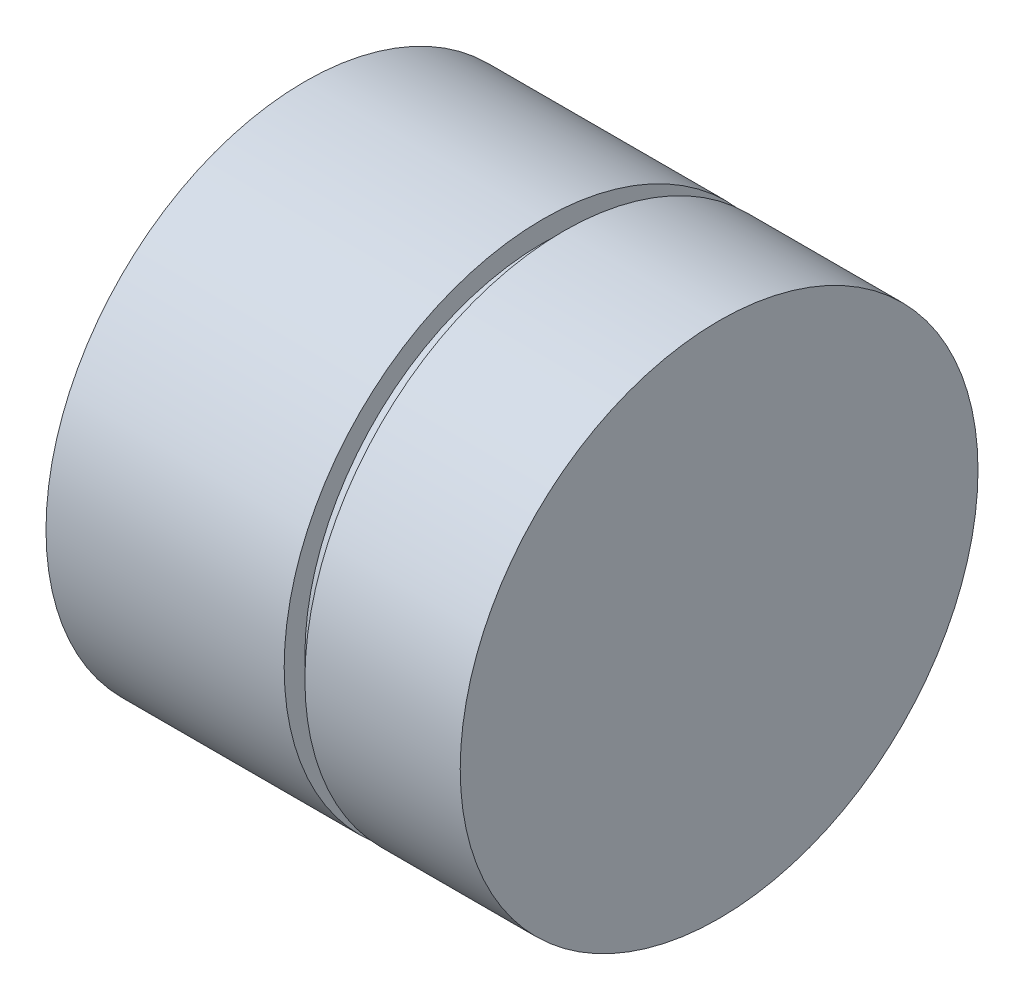
ISO-10303-21;
HEADER;
FILE_DESCRIPTION(('STEP AP214'),'2;1');
FILE_NAME('part.step','',(''),(''),'','','');
FILE_SCHEMA(('AUTOMOTIVE_DESIGN { 1 0 10303 214 1 1 1 1 }'));
ENDSEC;
DATA;
#1=APPLICATION_CONTEXT('core data for automotive mechanical design processes');
#2=APPLICATION_PROTOCOL_DEFINITION('international standard','automotive_design',2000,#1);
#3=PRODUCT_CONTEXT('',#1,'mechanical');
#4=PRODUCT('Part','Part','',(#3));
#5=PRODUCT_RELATED_PRODUCT_CATEGORY('part','',(#4));
#6=PRODUCT_DEFINITION_FORMATION('','',#4);
#7=PRODUCT_DEFINITION_CONTEXT('part definition',#1,'design');
#8=PRODUCT_DEFINITION('design','',#6,#7);
#9=PRODUCT_DEFINITION_SHAPE('','',#8);
#10=(LENGTH_UNIT() NAMED_UNIT(*) SI_UNIT(.MILLI.,.METRE.));
#11=(NAMED_UNIT(*) PLANE_ANGLE_UNIT() SI_UNIT($,.RADIAN.));
#12=(NAMED_UNIT(*) SI_UNIT($,.STERADIAN.) SOLID_ANGLE_UNIT());
#13=UNCERTAINTY_MEASURE_WITH_UNIT(LENGTH_MEASURE(1.E-05),#10,'distance_accuracy_value','');
#14=(GEOMETRIC_REPRESENTATION_CONTEXT(3) GLOBAL_UNCERTAINTY_ASSIGNED_CONTEXT((#13)) GLOBAL_UNIT_ASSIGNED_CONTEXT((#10,
#11,#12)) REPRESENTATION_CONTEXT('',''));
#15=CARTESIAN_POINT('',(0.,0.,0.));
#16=DIRECTION('',(0.,0.,1.));
#17=DIRECTION('',(1.,0.,0.));
#18=AXIS2_PLACEMENT_3D('',#15,#16,#17);
#19=CARTESIAN_POINT('',(2.5,0.,0.));
#20=DIRECTION('',(-1.,0.,0.));
#21=DIRECTION('',(0.,0.,1.));
#22=AXIS2_PLACEMENT_3D('',#19,#20,#21);
#23=CYLINDRICAL_SURFACE('',#22,2.5);
#24=CARTESIAN_POINT('',(0.,0.,0.));
#25=DIRECTION('',(1.,0.,0.));
#26=DIRECTION('',(0.,0.,-1.));
#27=AXIS2_PLACEMENT_3D('',#24,#25,#26);
#28=CIRCLE('',#27,2.5);
#29=CARTESIAN_POINT('',(0.,0.,-2.5));
#30=VERTEX_POINT('',#29);
#31=EDGE_CURVE('E10',#30,#30,#28,.T.);
#32=ORIENTED_EDGE('',*,*,#31,.T.);
#33=EDGE_LOOP('',(#32));
#34=FACE_BOUND('',#33,.T.);
#35=CARTESIAN_POINT('',(2.3,0.,0.));
#36=DIRECTION('',(1.,0.,0.));
#37=DIRECTION('',(0.,0.,-1.));
#38=AXIS2_PLACEMENT_3D('',#35,#36,#37);
#39=CIRCLE('',#38,2.5);
#40=CARTESIAN_POINT('',(2.3,0.,-2.5));
#41=VERTEX_POINT('',#40);
#42=EDGE_CURVE('E59',#41,#41,#39,.T.);
#43=ORIENTED_EDGE('',*,*,#42,.F.);
#44=EDGE_LOOP('',(#43));
#45=FACE_BOUND('',#44,.T.);
#46=ADVANCED_FACE('F51',(#34,#45),#23,.T.);
#47=CARTESIAN_POINT('',(0.,0.,0.));
#48=DIRECTION('',(1.,0.,0.));
#49=DIRECTION('',(0.,0.,-1.));
#50=AXIS2_PLACEMENT_3D('',#47,#48,#49);
#51=PLANE('',#50);
#52=CARTESIAN_POINT('',(0.,1.,0.));
#53=DIRECTION('',(-1.,0.,0.));
#54=DIRECTION('',(0.,0.,1.));
#55=AXIS2_PLACEMENT_3D('',#52,#53,#54);
#56=CIRCLE('',#55,0.15);
#57=CARTESIAN_POINT('',(0.,1.,0.15));
#58=VERTEX_POINT('',#57);
#59=EDGE_CURVE('E109',#58,#58,#56,.T.);
#60=ORIENTED_EDGE('',*,*,#59,.F.);
#61=EDGE_LOOP('',(#60));
#62=FACE_BOUND('',#61,.T.);
#63=CARTESIAN_POINT('',(0.,-0.500000000000004,-0.866025403784436));
#64=DIRECTION('',(-1.,0.,0.));
#65=DIRECTION('',(0.,0.,1.));
#66=AXIS2_PLACEMENT_3D('',#63,#64,#65);
#67=CIRCLE('',#66,0.15);
#68=CARTESIAN_POINT('',(0.,-0.500000000000004,-0.716025403784436));
#69=VERTEX_POINT('',#68);
#70=EDGE_CURVE('E106',#69,#69,#67,.T.);
#71=ORIENTED_EDGE('',*,*,#70,.F.);
#72=EDGE_LOOP('',(#71));
#73=FACE_BOUND('',#72,.T.);
#74=CARTESIAN_POINT('',(0.,-0.500000000000004,0.866025403784436));
#75=DIRECTION('',(-1.,0.,0.));
#76=DIRECTION('',(0.,0.,1.));
#77=AXIS2_PLACEMENT_3D('',#74,#75,#76);
#78=CIRCLE('',#77,0.15);
#79=CARTESIAN_POINT('',(0.,-0.500000000000004,1.01602540378444));
#80=VERTEX_POINT('',#79);
#81=EDGE_CURVE('E98',#80,#80,#78,.T.);
#82=ORIENTED_EDGE('',*,*,#81,.F.);
#83=EDGE_LOOP('',(#82));
#84=FACE_BOUND('',#83,.T.);
#85=CARTESIAN_POINT('',(0.,0.,0.));
#86=DIRECTION('',(-1.,0.,0.));
#87=DIRECTION('',(0.,0.,1.));
#88=AXIS2_PLACEMENT_3D('',#85,#86,#87);
#89=CIRCLE('',#88,0.5);
#90=CARTESIAN_POINT('',(0.,0.,0.5));
#91=VERTEX_POINT('',#90);
#92=EDGE_CURVE('E88',#91,#91,#89,.T.);
#93=ORIENTED_EDGE('',*,*,#92,.F.);
#94=EDGE_LOOP('',(#93));
#95=FACE_BOUND('',#94,.T.);
#96=ORIENTED_EDGE('',*,*,#31,.F.);
#97=EDGE_LOOP('',(#96));
#98=FACE_BOUND('',#97,.T.);
#99=ADVANCED_FACE('F126',(#62,#73,#84,#95,#98),#51,.F.);
#100=CARTESIAN_POINT('',(2.5,0.,0.));
#101=DIRECTION('',(1.,0.,0.));
#102=DIRECTION('',(0.,0.,-1.));
#103=AXIS2_PLACEMENT_3D('',#100,#101,#102);
#104=PLANE('',#103);
#105=CARTESIAN_POINT('',(2.5,0.,0.));
#106=DIRECTION('',(1.,0.,0.));
#107=DIRECTION('',(0.,0.,-1.));
#108=AXIS2_PLACEMENT_3D('',#105,#106,#107);
#109=CIRCLE('',#108,2.3);
#110=CARTESIAN_POINT('',(2.5,0.,-2.3));
#111=VERTEX_POINT('',#110);
#112=EDGE_CURVE('E72',#111,#111,#109,.T.);
#113=ORIENTED_EDGE('',*,*,#112,.T.);
#114=EDGE_LOOP('',(#113));
#115=FACE_BOUND('',#114,.T.);
#116=CARTESIAN_POINT('',(2.5,0.,0.));
#117=DIRECTION('',(-1.,0.,0.));
#118=DIRECTION('',(0.,0.,1.));
#119=AXIS2_PLACEMENT_3D('',#116,#117,#118);
#120=CIRCLE('',#119,2.5);
#121=CARTESIAN_POINT('',(2.5,0.,2.5));
#122=VERTEX_POINT('',#121);
#123=EDGE_CURVE('E79',#122,#122,#120,.T.);
#124=ORIENTED_EDGE('',*,*,#123,.T.);
#125=EDGE_LOOP('',(#124));
#126=FACE_BOUND('',#125,.T.);
#127=ADVANCED_FACE('F131',(#115,#126),#104,.F.);
#128=CARTESIAN_POINT('',(2.3,0.,0.));
#129=DIRECTION('',(1.,0.,0.));
#130=DIRECTION('',(0.,0.,-1.));
#131=AXIS2_PLACEMENT_3D('',#128,#129,#130);
#132=PLANE('',#131);
#133=CARTESIAN_POINT('',(2.3,0.,0.));
#134=DIRECTION('',(1.,0.,0.));
#135=DIRECTION('',(0.,0.,-1.));
#136=AXIS2_PLACEMENT_3D('',#133,#134,#135);
#137=CIRCLE('',#136,2.3);
#138=CARTESIAN_POINT('',(2.3,0.,-2.3));
#139=VERTEX_POINT('',#138);
#140=EDGE_CURVE('E65',#139,#139,#137,.T.);
#141=ORIENTED_EDGE('',*,*,#140,.F.);
#142=EDGE_LOOP('',(#141));
#143=FACE_BOUND('',#142,.T.);
#144=ORIENTED_EDGE('',*,*,#42,.T.);
#145=EDGE_LOOP('',(#144));
#146=FACE_BOUND('',#145,.T.);
#147=ADVANCED_FACE('F172',(#143,#146),#132,.T.);
#148=CARTESIAN_POINT('',(2.3,0.,0.));
#149=DIRECTION('',(1.,0.,0.));
#150=DIRECTION('',(0.,0.,-1.));
#151=AXIS2_PLACEMENT_3D('',#148,#149,#150);
#152=CYLINDRICAL_SURFACE('',#151,2.3);
#153=ORIENTED_EDGE('',*,*,#140,.T.);
#154=EDGE_LOOP('',(#153));
#155=FACE_BOUND('',#154,.T.);
#156=ORIENTED_EDGE('',*,*,#112,.F.);
#157=EDGE_LOOP('',(#156));
#158=FACE_BOUND('',#157,.T.);
#159=ADVANCED_FACE('F178',(#155,#158),#152,.T.);
#160=CARTESIAN_POINT('',(4.,0.,0.));
#161=DIRECTION('',(-1.,0.,0.));
#162=DIRECTION('',(0.,0.,1.));
#163=AXIS2_PLACEMENT_3D('',#160,#161,#162);
#164=CYLINDRICAL_SURFACE('',#163,2.5);
#165=CARTESIAN_POINT('',(4.,0.,0.));
#166=DIRECTION('',(-1.,0.,0.));
#167=DIRECTION('',(0.,0.,1.));
#168=AXIS2_PLACEMENT_3D('',#165,#166,#167);
#169=CIRCLE('',#168,2.5);
#170=CARTESIAN_POINT('',(4.,0.,2.5));
#171=VERTEX_POINT('',#170);
#172=EDGE_CURVE('E76',#171,#171,#169,.T.);
#173=ORIENTED_EDGE('',*,*,#172,.T.);
#174=EDGE_LOOP('',(#173));
#175=FACE_BOUND('',#174,.T.);
#176=ORIENTED_EDGE('',*,*,#123,.F.);
#177=EDGE_LOOP('',(#176));
#178=FACE_BOUND('',#177,.T.);
#179=ADVANCED_FACE('F155',(#175,#178),#164,.T.);
#180=CARTESIAN_POINT('',(4.,0.,0.));
#181=DIRECTION('',(1.,0.,0.));
#182=DIRECTION('',(0.,0.,-1.));
#183=AXIS2_PLACEMENT_3D('',#180,#181,#182);
#184=PLANE('',#183);
#185=ORIENTED_EDGE('',*,*,#172,.F.);
#186=EDGE_LOOP('',(#185));
#187=FACE_BOUND('',#186,.T.);
#188=ADVANCED_FACE('F142',(#187),#184,.T.);
#189=CARTESIAN_POINT('',(0.4,0.,0.));
#190=DIRECTION('',(-1.,0.,0.));
#191=DIRECTION('',(0.,0.,1.));
#192=AXIS2_PLACEMENT_3D('',#189,#190,#191);
#193=CYLINDRICAL_SURFACE('',#192,0.5);
#194=CARTESIAN_POINT('',(0.4,0.,0.));
#195=DIRECTION('',(-1.,0.,0.));
#196=DIRECTION('',(0.,0.,1.));
#197=AXIS2_PLACEMENT_3D('',#194,#195,#196);
#198=CIRCLE('',#197,0.5);
#199=CARTESIAN_POINT('',(0.4,0.,0.5));
#200=VERTEX_POINT('',#199);
#201=EDGE_CURVE('E82',#200,#200,#198,.T.);
#202=ORIENTED_EDGE('',*,*,#201,.F.);
#203=EDGE_LOOP('',(#202));
#204=FACE_BOUND('',#203,.T.);
#205=ORIENTED_EDGE('',*,*,#92,.T.);
#206=EDGE_LOOP('',(#205));
#207=FACE_BOUND('',#206,.T.);
#208=ADVANCED_FACE('F138',(#204,#207),#193,.F.);
#209=CARTESIAN_POINT('',(0.4,0.,0.));
#210=DIRECTION('',(-1.,0.,0.));
#211=DIRECTION('',(0.,0.,1.));
#212=AXIS2_PLACEMENT_3D('',#209,#210,#211);
#213=PLANE('',#212);
#214=ORIENTED_EDGE('',*,*,#201,.T.);
#215=EDGE_LOOP('',(#214));
#216=FACE_BOUND('',#215,.T.);
#217=ADVANCED_FACE('F143',(#216),#213,.T.);
#218=CARTESIAN_POINT('',(0.8,-0.500000000000004,0.866025403784436));
#219=DIRECTION('',(-1.,0.,0.));
#220=DIRECTION('',(0.,0.,1.));
#221=AXIS2_PLACEMENT_3D('',#218,#219,#220);
#222=CYLINDRICAL_SURFACE('',#221,0.15);
#223=CARTESIAN_POINT('',(0.8,-0.500000000000004,0.866025403784436));
#224=DIRECTION('',(-1.,0.,0.));
#225=DIRECTION('',(0.,0.,1.));
#226=AXIS2_PLACEMENT_3D('',#223,#224,#225);
#227=CIRCLE('',#226,0.15);
#228=CARTESIAN_POINT('',(0.8,-0.500000000000004,1.01602540378444));
#229=VERTEX_POINT('',#228);
#230=EDGE_CURVE('E94',#229,#229,#227,.T.);
#231=ORIENTED_EDGE('',*,*,#230,.F.);
#232=EDGE_LOOP('',(#231));
#233=FACE_BOUND('',#232,.T.);
#234=ORIENTED_EDGE('',*,*,#81,.T.);
#235=EDGE_LOOP('',(#234));
#236=FACE_BOUND('',#235,.T.);
#237=ADVANCED_FACE('F149',(#233,#236),#222,.F.);
#238=CARTESIAN_POINT('',(0.8,-0.500000000000004,0.866025403784436));
#239=DIRECTION('',(-1.,0.,0.));
#240=DIRECTION('',(0.,0.,1.));
#241=AXIS2_PLACEMENT_3D('',#238,#239,#240);
#242=PLANE('',#241);
#243=ORIENTED_EDGE('',*,*,#230,.T.);
#244=EDGE_LOOP('',(#243));
#245=FACE_BOUND('',#244,.T.);
#246=ADVANCED_FACE('F212',(#245),#242,.T.);
#247=CARTESIAN_POINT('',(0.8,-0.500000000000004,-0.866025403784436));
#248=DIRECTION('',(-1.,0.,0.));
#249=DIRECTION('',(0.,0.,1.));
#250=AXIS2_PLACEMENT_3D('',#247,#248,#249);
#251=CYLINDRICAL_SURFACE('',#250,0.15);
#252=CARTESIAN_POINT('',(0.8,-0.500000000000004,-0.866025403784436));
#253=DIRECTION('',(-1.,0.,0.));
#254=DIRECTION('',(0.,0.,1.));
#255=AXIS2_PLACEMENT_3D('',#252,#253,#254);
#256=CIRCLE('',#255,0.15);
#257=CARTESIAN_POINT('',(0.8,-0.500000000000004,-0.716025403784436));
#258=VERTEX_POINT('',#257);
#259=EDGE_CURVE('E105',#258,#258,#256,.T.);
#260=ORIENTED_EDGE('',*,*,#259,.F.);
#261=EDGE_LOOP('',(#260));
#262=FACE_BOUND('',#261,.T.);
#263=ORIENTED_EDGE('',*,*,#70,.T.);
#264=EDGE_LOOP('',(#263));
#265=FACE_BOUND('',#264,.T.);
#266=ADVANCED_FACE('F224',(#262,#265),#251,.F.);
#267=CARTESIAN_POINT('',(0.8,-0.500000000000004,-0.866025403784436));
#268=DIRECTION('',(-1.,0.,0.));
#269=DIRECTION('',(0.,0.,1.));
#270=AXIS2_PLACEMENT_3D('',#267,#268,#269);
#271=PLANE('',#270);
#272=ORIENTED_EDGE('',*,*,#259,.T.);
#273=EDGE_LOOP('',(#272));
#274=FACE_BOUND('',#273,.T.);
#275=ADVANCED_FACE('F123',(#274),#271,.T.);
#276=CARTESIAN_POINT('',(0.8,1.,0.));
#277=DIRECTION('',(-1.,0.,0.));
#278=DIRECTION('',(0.,0.,1.));
#279=AXIS2_PLACEMENT_3D('',#276,#277,#278);
#280=CYLINDRICAL_SURFACE('',#279,0.15);
#281=CARTESIAN_POINT('',(0.8,1.,0.));
#282=DIRECTION('',(-1.,0.,0.));
#283=DIRECTION('',(0.,0.,1.));
#284=AXIS2_PLACEMENT_3D('',#281,#282,#283);
#285=CIRCLE('',#284,0.15);
#286=CARTESIAN_POINT('',(0.8,1.,0.15));
#287=VERTEX_POINT('',#286);
#288=EDGE_CURVE('E89',#287,#287,#285,.T.);
#289=ORIENTED_EDGE('',*,*,#288,.F.);
#290=EDGE_LOOP('',(#289));
#291=FACE_BOUND('',#290,.T.);
#292=ORIENTED_EDGE('',*,*,#59,.T.);
#293=EDGE_LOOP('',(#292));
#294=FACE_BOUND('',#293,.T.);
#295=ADVANCED_FACE('F121',(#291,#294),#280,.F.);
#296=CARTESIAN_POINT('',(0.8,1.,0.));
#297=DIRECTION('',(-1.,0.,0.));
#298=DIRECTION('',(0.,0.,1.));
#299=AXIS2_PLACEMENT_3D('',#296,#297,#298);
#300=PLANE('',#299);
#301=ORIENTED_EDGE('',*,*,#288,.T.);
#302=EDGE_LOOP('',(#301));
#303=FACE_BOUND('',#302,.T.);
#304=ADVANCED_FACE('F118',(#303),#300,.T.);
#305=CLOSED_SHELL('',(#46,#99,#127,#147,#159,#179,#188,#208,#217,#237,#246,#266,#275,#295,#304));
#306=MANIFOLD_SOLID_BREP('B2',#305);
#307=ADVANCED_BREP_SHAPE_REPRESENTATION('',(#18,#306),#14);
#308=SHAPE_DEFINITION_REPRESENTATION(#9,#307);
ENDSEC;
END-ISO-10303-21;
